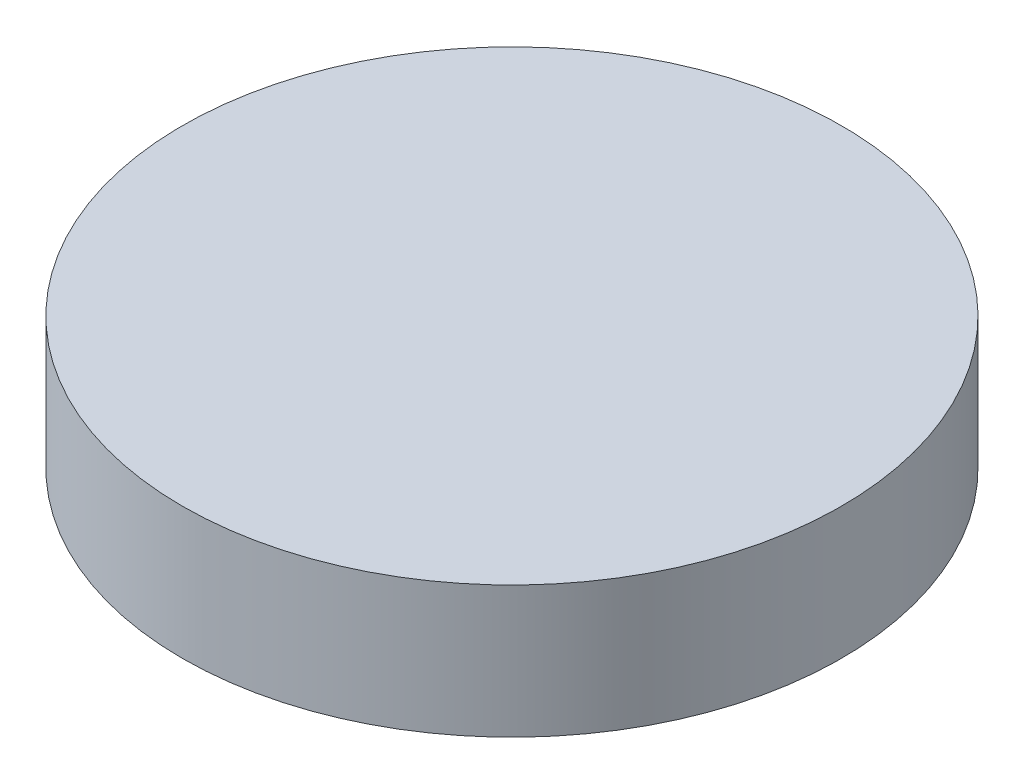
ISO-10303-21;
HEADER;
FILE_DESCRIPTION(('STEP AP214'),'2;1');
FILE_NAME('part.step','',(''),(''),'','','');
FILE_SCHEMA(('AUTOMOTIVE_DESIGN { 1 0 10303 214 1 1 1 1 }'));
ENDSEC;
DATA;
#1=APPLICATION_CONTEXT('core data for automotive mechanical design processes');
#2=APPLICATION_PROTOCOL_DEFINITION('international standard','automotive_design',2000,#1);
#3=PRODUCT_CONTEXT('',#1,'mechanical');
#4=PRODUCT('Part','Part','',(#3));
#5=PRODUCT_RELATED_PRODUCT_CATEGORY('part','',(#4));
#6=PRODUCT_DEFINITION_FORMATION('','',#4);
#7=PRODUCT_DEFINITION_CONTEXT('part definition',#1,'design');
#8=PRODUCT_DEFINITION('design','',#6,#7);
#9=PRODUCT_DEFINITION_SHAPE('','',#8);
#10=(LENGTH_UNIT() NAMED_UNIT(*) SI_UNIT(.MILLI.,.METRE.));
#11=(NAMED_UNIT(*) PLANE_ANGLE_UNIT() SI_UNIT($,.RADIAN.));
#12=(NAMED_UNIT(*) SI_UNIT($,.STERADIAN.) SOLID_ANGLE_UNIT());
#13=UNCERTAINTY_MEASURE_WITH_UNIT(LENGTH_MEASURE(1.E-05),#10,'distance_accuracy_value','');
#14=(GEOMETRIC_REPRESENTATION_CONTEXT(3) GLOBAL_UNCERTAINTY_ASSIGNED_CONTEXT((#13)) GLOBAL_UNIT_ASSIGNED_CONTEXT((#10,
#11,#12)) REPRESENTATION_CONTEXT('',''));
#15=CARTESIAN_POINT('',(0.,0.,0.));
#16=DIRECTION('',(0.,0.,1.));
#17=DIRECTION('',(1.,0.,0.));
#18=AXIS2_PLACEMENT_3D('',#15,#16,#17);
#19=CARTESIAN_POINT('',(0.,3.,0.));
#20=DIRECTION('',(0.,-1.,0.));
#21=DIRECTION('',(0.,0.,-1.));
#22=AXIS2_PLACEMENT_3D('',#19,#20,#21);
#23=CYLINDRICAL_SURFACE('',#22,10.);
#24=CARTESIAN_POINT('',(0.,0.,0.));
#25=DIRECTION('',(0.,1.,0.));
#26=DIRECTION('',(0.,0.,1.));
#27=AXIS2_PLACEMENT_3D('',#24,#25,#26);
#28=CIRCLE('',#27,10.);
#29=CARTESIAN_POINT('',(0.,0.,10.));
#30=VERTEX_POINT('',#29);
#31=EDGE_CURVE('E11',#30,#30,#28,.T.);
#32=ORIENTED_EDGE('',*,*,#31,.T.);
#33=EDGE_LOOP('',(#32));
#34=FACE_BOUND('',#33,.T.);
#35=CARTESIAN_POINT('',(0.,4.,0.));
#36=DIRECTION('',(0.,1.,0.));
#37=DIRECTION('',(0.,0.,1.));
#38=AXIS2_PLACEMENT_3D('',#35,#36,#37);
#39=CIRCLE('',#38,10.);
#40=CARTESIAN_POINT('',(0.,4.,10.));
#41=VERTEX_POINT('',#40);
#42=EDGE_CURVE('E119',#41,#41,#39,.T.);
#43=ORIENTED_EDGE('',*,*,#42,.F.);
#44=EDGE_LOOP('',(#43));
#45=FACE_BOUND('',#44,.T.);
#46=ADVANCED_FACE('F32',(#34,#45),#23,.T.);
#47=CARTESIAN_POINT('',(0.,0.,0.));
#48=DIRECTION('',(0.,1.,0.));
#49=DIRECTION('',(0.,0.,1.));
#50=AXIS2_PLACEMENT_3D('',#47,#48,#49);
#51=PLANE('',#50);
#52=DIRECTION('',(0.732095923851295,0.,0.681201554813492));
#53=VECTOR('',#52,1.);
#54=CARTESIAN_POINT('',(-3.86357066732583,0.,1.18581407982567));
#55=LINE('',#54,#53);
#56=CARTESIAN_POINT('',(-3.86357066732583,0.,1.18581407982567));
#57=VERTEX_POINT('',#56);
#58=CARTESIAN_POINT('',(-0.904840216368614,0.,3.9388573871334));
#59=VERTEX_POINT('',#58);
#60=EDGE_CURVE('E105',#57,#59,#55,.T.);
#61=ORIENTED_EDGE('',*,*,#60,.T.);
#62=DIRECTION('',(0.955985813491589,0.,-0.293412890655514));
#63=VECTOR('',#62,1.);
#64=CARTESIAN_POINT('',(-0.904840216368614,0.,3.9388573871334));
#65=LINE('',#64,#63);
#66=CARTESIAN_POINT('',(2.95873045095721,0.,2.75304330730773));
#67=VERTEX_POINT('',#66);
#68=EDGE_CURVE('E128',#59,#67,#65,.T.);
#69=ORIENTED_EDGE('',*,*,#68,.T.);
#70=DIRECTION('',(0.223889889640294,0.,-0.974614445469006));
#71=VECTOR('',#70,1.);
#72=CARTESIAN_POINT('',(2.95873045095721,0.,2.75304330730773));
#73=LINE('',#72,#71);
#74=CARTESIAN_POINT('',(3.86357066732583,0.,-1.18581407982567));
#75=VERTEX_POINT('',#74);
#76=EDGE_CURVE('E111',#67,#75,#73,.T.);
#77=ORIENTED_EDGE('',*,*,#76,.T.);
#78=DIRECTION('',(-0.732095923851295,0.,-0.681201554813492));
#79=VECTOR('',#78,1.);
#80=CARTESIAN_POINT('',(3.86357066732583,0.,-1.18581407982567));
#81=LINE('',#80,#79);
#82=CARTESIAN_POINT('',(0.904840216368616,0.,-3.9388573871334));
#83=VERTEX_POINT('',#82);
#84=EDGE_CURVE('E46',#75,#83,#81,.T.);
#85=ORIENTED_EDGE('',*,*,#84,.T.);
#86=DIRECTION('',(-0.955985813491589,0.,0.293412890655514));
#87=VECTOR('',#86,1.);
#88=CARTESIAN_POINT('',(0.904840216368616,0.,-3.9388573871334));
#89=LINE('',#88,#87);
#90=CARTESIAN_POINT('',(-2.95873045095721,0.,-2.75304330730773));
#91=VERTEX_POINT('',#90);
#92=EDGE_CURVE('E92',#83,#91,#89,.T.);
#93=ORIENTED_EDGE('',*,*,#92,.T.);
#94=DIRECTION('',(-0.223889889640294,0.,0.974614445469006));
#95=VECTOR('',#94,1.);
#96=CARTESIAN_POINT('',(-2.95873045095721,0.,-2.75304330730773));
#97=LINE('',#96,#95);
#98=EDGE_CURVE('E100',#91,#57,#97,.T.);
#99=ORIENTED_EDGE('',*,*,#98,.T.);
#100=EDGE_LOOP('',(#61,#69,#77,#85,#93,#99));
#101=FACE_BOUND('',#100,.T.);
#102=ORIENTED_EDGE('',*,*,#31,.F.);
#103=EDGE_LOOP('',(#102));
#104=FACE_BOUND('',#103,.T.);
#105=ADVANCED_FACE('F107',(#101,#104),#51,.F.);
#106=CARTESIAN_POINT('',(-0.904840216368614,0.,3.9388573871334));
#107=DIRECTION('',(0.293412890655514,0.,0.955985813491589));
#108=DIRECTION('',(0.955985813491589,0.,-0.293412890655514));
#109=AXIS2_PLACEMENT_3D('',#106,#107,#108);
#110=PLANE('',#109);
#111=DIRECTION('',(0.955985813491589,0.,-0.293412890655514));
#112=VECTOR('',#111,1.);
#113=CARTESIAN_POINT('',(-0.904840216368614,3.,3.9388573871334));
#114=LINE('',#113,#112);
#115=CARTESIAN_POINT('',(-0.904840216368614,3.,3.9388573871334));
#116=VERTEX_POINT('',#115);
#117=CARTESIAN_POINT('',(2.95873045095721,3.,2.75304330730773));
#118=VERTEX_POINT('',#117);
#119=EDGE_CURVE('E77',#116,#118,#114,.T.);
#120=ORIENTED_EDGE('',*,*,#119,.T.);
#121=DIRECTION('',(0.,1.,0.));
#122=VECTOR('',#121,1.);
#123=CARTESIAN_POINT('',(2.95873045095721,0.,2.75304330730773));
#124=LINE('',#123,#122);
#125=EDGE_CURVE('E116',#67,#118,#124,.T.);
#126=ORIENTED_EDGE('',*,*,#125,.F.);
#127=ORIENTED_EDGE('',*,*,#68,.F.);
#128=DIRECTION('',(0.,1.,0.));
#129=VECTOR('',#128,1.);
#130=CARTESIAN_POINT('',(-0.904840216368614,0.,3.9388573871334));
#131=LINE('',#130,#129);
#132=EDGE_CURVE('E39',#59,#116,#131,.T.);
#133=ORIENTED_EDGE('',*,*,#132,.T.);
#134=EDGE_LOOP('',(#120,#126,#127,#133));
#135=FACE_BOUND('',#134,.T.);
#136=ADVANCED_FACE('F142',(#135),#110,.F.);
#137=CARTESIAN_POINT('',(-3.86357066732583,0.,1.18581407982567));
#138=DIRECTION('',(-0.681201554813492,0.,0.732095923851295));
#139=DIRECTION('',(0.732095923851295,0.,0.681201554813492));
#140=AXIS2_PLACEMENT_3D('',#137,#138,#139);
#141=PLANE('',#140);
#142=DIRECTION('',(0.732095923851295,0.,0.681201554813492));
#143=VECTOR('',#142,1.);
#144=CARTESIAN_POINT('',(-3.86357066732583,3.,1.18581407982567));
#145=LINE('',#144,#143);
#146=CARTESIAN_POINT('',(-3.86357066732583,3.,1.18581407982567));
#147=VERTEX_POINT('',#146);
#148=EDGE_CURVE('E126',#147,#116,#145,.T.);
#149=ORIENTED_EDGE('',*,*,#148,.T.);
#150=ORIENTED_EDGE('',*,*,#132,.F.);
#151=ORIENTED_EDGE('',*,*,#60,.F.);
#152=DIRECTION('',(0.,1.,0.));
#153=VECTOR('',#152,1.);
#154=CARTESIAN_POINT('',(-3.86357066732583,0.,1.18581407982567));
#155=LINE('',#154,#153);
#156=EDGE_CURVE('E96',#57,#147,#155,.T.);
#157=ORIENTED_EDGE('',*,*,#156,.T.);
#158=EDGE_LOOP('',(#149,#150,#151,#157));
#159=FACE_BOUND('',#158,.T.);
#160=ADVANCED_FACE('F143',(#159),#141,.F.);
#161=CARTESIAN_POINT('',(-2.95873045095721,0.,-2.75304330730773));
#162=DIRECTION('',(-0.974614445469005,0.,-0.223889889640294));
#163=DIRECTION('',(-0.223889889640294,0.,0.974614445469006));
#164=AXIS2_PLACEMENT_3D('',#161,#162,#163);
#165=PLANE('',#164);
#166=DIRECTION('',(-0.223889889640294,0.,0.974614445469006));
#167=VECTOR('',#166,1.);
#168=CARTESIAN_POINT('',(-2.95873045095721,3.,-2.75304330730773));
#169=LINE('',#168,#167);
#170=CARTESIAN_POINT('',(-2.95873045095721,3.,-2.75304330730773));
#171=VERTEX_POINT('',#170);
#172=EDGE_CURVE('E124',#171,#147,#169,.T.);
#173=ORIENTED_EDGE('',*,*,#172,.T.);
#174=ORIENTED_EDGE('',*,*,#156,.F.);
#175=ORIENTED_EDGE('',*,*,#98,.F.);
#176=DIRECTION('',(0.,1.,0.));
#177=VECTOR('',#176,1.);
#178=CARTESIAN_POINT('',(-2.95873045095721,0.,-2.75304330730773));
#179=LINE('',#178,#177);
#180=EDGE_CURVE('E87',#91,#171,#179,.T.);
#181=ORIENTED_EDGE('',*,*,#180,.T.);
#182=EDGE_LOOP('',(#173,#174,#175,#181));
#183=FACE_BOUND('',#182,.T.);
#184=ADVANCED_FACE('F101',(#183),#165,.F.);
#185=CARTESIAN_POINT('',(0.904840216368616,0.,-3.9388573871334));
#186=DIRECTION('',(-0.293412890655514,0.,-0.955985813491589));
#187=DIRECTION('',(-0.955985813491589,0.,0.293412890655514));
#188=AXIS2_PLACEMENT_3D('',#185,#186,#187);
#189=PLANE('',#188);
#190=DIRECTION('',(-0.955985813491589,0.,0.293412890655514));
#191=VECTOR('',#190,1.);
#192=CARTESIAN_POINT('',(0.904840216368616,3.,-3.9388573871334));
#193=LINE('',#192,#191);
#194=CARTESIAN_POINT('',(0.904840216368616,3.,-3.9388573871334));
#195=VERTEX_POINT('',#194);
#196=EDGE_CURVE('E93',#195,#171,#193,.T.);
#197=ORIENTED_EDGE('',*,*,#196,.T.);
#198=ORIENTED_EDGE('',*,*,#180,.F.);
#199=ORIENTED_EDGE('',*,*,#92,.F.);
#200=DIRECTION('',(0.,1.,0.));
#201=VECTOR('',#200,1.);
#202=CARTESIAN_POINT('',(0.904840216368616,0.,-3.9388573871334));
#203=LINE('',#202,#201);
#204=EDGE_CURVE('E97',#83,#195,#203,.T.);
#205=ORIENTED_EDGE('',*,*,#204,.T.);
#206=EDGE_LOOP('',(#197,#198,#199,#205));
#207=FACE_BOUND('',#206,.T.);
#208=ADVANCED_FACE('F89',(#207),#189,.F.);
#209=CARTESIAN_POINT('',(3.86357066732583,0.,-1.18581407982567));
#210=DIRECTION('',(0.681201554813492,0.,-0.732095923851295));
#211=DIRECTION('',(-0.732095923851295,0.,-0.681201554813492));
#212=AXIS2_PLACEMENT_3D('',#209,#210,#211);
#213=PLANE('',#212);
#214=DIRECTION('',(-0.732095923851295,0.,-0.681201554813492));
#215=VECTOR('',#214,1.);
#216=CARTESIAN_POINT('',(3.86357066732583,3.,-1.18581407982567));
#217=LINE('',#216,#215);
#218=CARTESIAN_POINT('',(3.86357066732583,3.,-1.18581407982567));
#219=VERTEX_POINT('',#218);
#220=EDGE_CURVE('E68',#219,#195,#217,.T.);
#221=ORIENTED_EDGE('',*,*,#220,.T.);
#222=ORIENTED_EDGE('',*,*,#204,.F.);
#223=ORIENTED_EDGE('',*,*,#84,.F.);
#224=DIRECTION('',(0.,1.,0.));
#225=VECTOR('',#224,1.);
#226=CARTESIAN_POINT('',(3.86357066732583,0.,-1.18581407982567));
#227=LINE('',#226,#225);
#228=EDGE_CURVE('E132',#75,#219,#227,.T.);
#229=ORIENTED_EDGE('',*,*,#228,.T.);
#230=EDGE_LOOP('',(#221,#222,#223,#229));
#231=FACE_BOUND('',#230,.T.);
#232=ADVANCED_FACE('F147',(#231),#213,.F.);
#233=CARTESIAN_POINT('',(2.95873045095721,0.,2.75304330730773));
#234=DIRECTION('',(0.974614445469005,0.,0.223889889640294));
#235=DIRECTION('',(0.223889889640294,0.,-0.974614445469006));
#236=AXIS2_PLACEMENT_3D('',#233,#234,#235);
#237=PLANE('',#236);
#238=DIRECTION('',(0.223889889640294,0.,-0.974614445469006));
#239=VECTOR('',#238,1.);
#240=CARTESIAN_POINT('',(2.95873045095721,3.,2.75304330730773));
#241=LINE('',#240,#239);
#242=EDGE_CURVE('E118',#118,#219,#241,.T.);
#243=ORIENTED_EDGE('',*,*,#242,.T.);
#244=ORIENTED_EDGE('',*,*,#228,.F.);
#245=ORIENTED_EDGE('',*,*,#76,.F.);
#246=ORIENTED_EDGE('',*,*,#125,.T.);
#247=EDGE_LOOP('',(#243,#244,#245,#246));
#248=FACE_BOUND('',#247,.T.);
#249=ADVANCED_FACE('F137',(#248),#237,.F.);
#250=CARTESIAN_POINT('',(0.,3.,0.));
#251=DIRECTION('',(0.,1.,0.));
#252=DIRECTION('',(0.,0.,1.));
#253=AXIS2_PLACEMENT_3D('',#250,#251,#252);
#254=PLANE('',#253);
#255=ORIENTED_EDGE('',*,*,#242,.F.);
#256=ORIENTED_EDGE('',*,*,#119,.F.);
#257=ORIENTED_EDGE('',*,*,#148,.F.);
#258=ORIENTED_EDGE('',*,*,#172,.F.);
#259=ORIENTED_EDGE('',*,*,#196,.F.);
#260=ORIENTED_EDGE('',*,*,#220,.F.);
#261=EDGE_LOOP('',(#255,#256,#257,#258,#259,#260));
#262=FACE_BOUND('',#261,.T.);
#263=ADVANCED_FACE('F145',(#262),#254,.F.);
#264=CARTESIAN_POINT('',(0.,4.,0.));
#265=DIRECTION('',(0.,1.,0.));
#266=DIRECTION('',(0.,0.,1.));
#267=AXIS2_PLACEMENT_3D('',#264,#265,#266);
#268=PLANE('',#267);
#269=ORIENTED_EDGE('',*,*,#42,.T.);
#270=EDGE_LOOP('',(#269));
#271=FACE_BOUND('',#270,.T.);
#272=ADVANCED_FACE('F153',(#271),#268,.T.);
#273=CLOSED_SHELL('',(#46,#105,#136,#160,#184,#208,#232,#249,#263,#272));
#274=MANIFOLD_SOLID_BREP('B2',#273);
#275=ADVANCED_BREP_SHAPE_REPRESENTATION('',(#18,#274),#14);
#276=SHAPE_DEFINITION_REPRESENTATION(#9,#275);
ENDSEC;
END-ISO-10303-21;
